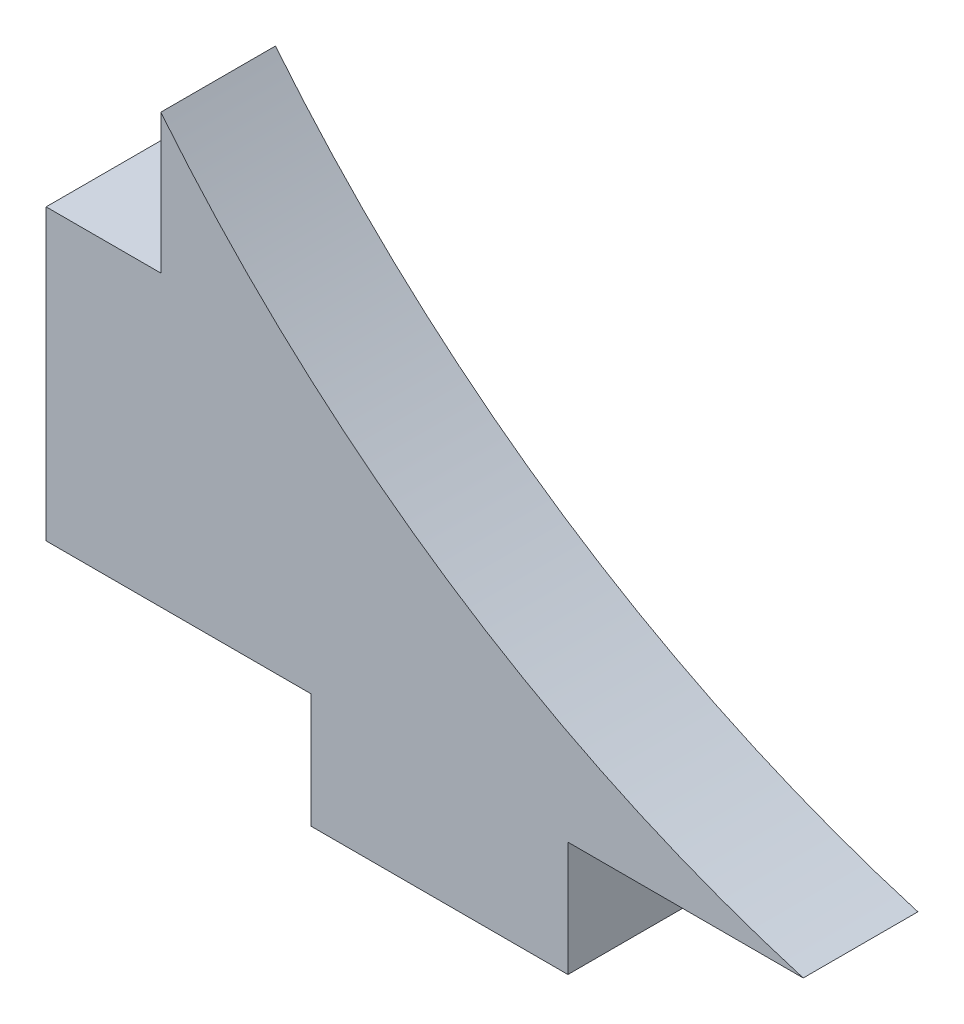
ISO-10303-21;
HEADER;
FILE_DESCRIPTION(('STEP AP214'),'2;1');
FILE_NAME('part.step','',(''),(''),'','','');
FILE_SCHEMA(('AUTOMOTIVE_DESIGN { 1 0 10303 214 1 1 1 1 }'));
ENDSEC;
DATA;
#1=APPLICATION_CONTEXT('core data for automotive mechanical design processes');
#2=APPLICATION_PROTOCOL_DEFINITION('international standard','automotive_design',2000,#1);
#3=PRODUCT_CONTEXT('',#1,'mechanical');
#4=PRODUCT('Part','Part','',(#3));
#5=PRODUCT_RELATED_PRODUCT_CATEGORY('part','',(#4));
#6=PRODUCT_DEFINITION_FORMATION('','',#4);
#7=PRODUCT_DEFINITION_CONTEXT('part definition',#1,'design');
#8=PRODUCT_DEFINITION('design','',#6,#7);
#9=PRODUCT_DEFINITION_SHAPE('','',#8);
#10=(LENGTH_UNIT() NAMED_UNIT(*) SI_UNIT(.MILLI.,.METRE.));
#11=(NAMED_UNIT(*) PLANE_ANGLE_UNIT() SI_UNIT($,.RADIAN.));
#12=(NAMED_UNIT(*) SI_UNIT($,.STERADIAN.) SOLID_ANGLE_UNIT());
#13=UNCERTAINTY_MEASURE_WITH_UNIT(LENGTH_MEASURE(1.E-05),#10,'distance_accuracy_value','');
#14=(GEOMETRIC_REPRESENTATION_CONTEXT(3) GLOBAL_UNCERTAINTY_ASSIGNED_CONTEXT((#13)) GLOBAL_UNIT_ASSIGNED_CONTEXT((#10,
#11,#12)) REPRESENTATION_CONTEXT('',''));
#15=CARTESIAN_POINT('',(0.,0.,0.));
#16=DIRECTION('',(0.,0.,1.));
#17=DIRECTION('',(1.,0.,0.));
#18=AXIS2_PLACEMENT_3D('',#15,#16,#17);
#19=CARTESIAN_POINT('',(34.0614146546456,63.4250505673138,5.35));
#20=DIRECTION('',(0.,0.,-1.));
#21=DIRECTION('',(-1.,0.,0.));
#22=AXIS2_PLACEMENT_3D('',#19,#20,#21);
#23=CYLINDRICAL_SURFACE('',#22,60.535);
#24=CARTESIAN_POINT('',(34.0614146546456,63.4250505673138,0.));
#25=DIRECTION('',(0.,0.,1.));
#26=DIRECTION('',(1.,0.,0.));
#27=AXIS2_PLACEMENT_3D('',#24,#25,#26);
#28=CIRCLE('',#27,60.535);
#29=CARTESIAN_POINT('',(-13.,25.35,0.));
#30=VERTEX_POINT('',#29);
#31=CARTESIAN_POINT('',(16.98,5.35,0.));
#32=VERTEX_POINT('',#31);
#33=EDGE_CURVE('E133',#30,#32,#28,.T.);
#34=ORIENTED_EDGE('',*,*,#33,.F.);
#35=DIRECTION('',(0.,0.,-1.));
#36=VECTOR('',#35,1.);
#37=CARTESIAN_POINT('',(-13.,25.35,5.35));
#38=LINE('',#37,#36);
#39=CARTESIAN_POINT('',(-13.,25.35,5.35));
#40=VERTEX_POINT('',#39);
#41=EDGE_CURVE('E11',#40,#30,#38,.T.);
#42=ORIENTED_EDGE('',*,*,#41,.F.);
#43=CARTESIAN_POINT('',(34.0614146546456,63.4250505673138,5.35));
#44=DIRECTION('',(0.,0.,1.));
#45=DIRECTION('',(1.,0.,0.));
#46=AXIS2_PLACEMENT_3D('',#43,#44,#45);
#47=CIRCLE('',#46,60.535);
#48=CARTESIAN_POINT('',(16.98,5.35,5.35));
#49=VERTEX_POINT('',#48);
#50=EDGE_CURVE('E155',#40,#49,#47,.T.);
#51=ORIENTED_EDGE('',*,*,#50,.T.);
#52=DIRECTION('',(0.,0.,-1.));
#53=VECTOR('',#52,1.);
#54=CARTESIAN_POINT('',(16.98,5.35,5.35));
#55=LINE('',#54,#53);
#56=EDGE_CURVE('E48',#49,#32,#55,.T.);
#57=ORIENTED_EDGE('',*,*,#56,.T.);
#58=EDGE_LOOP('',(#34,#42,#51,#57));
#59=FACE_BOUND('',#58,.T.);
#60=ADVANCED_FACE('F32',(#59),#23,.F.);
#61=CARTESIAN_POINT('',(-13.,0.,5.35));
#62=DIRECTION('',(1.,0.,0.));
#63=DIRECTION('',(0.,1.,0.));
#64=AXIS2_PLACEMENT_3D('',#61,#62,#63);
#65=PLANE('',#64);
#66=DIRECTION('',(0.,-1.,0.));
#67=VECTOR('',#66,1.);
#68=CARTESIAN_POINT('',(-13.,0.,0.));
#69=LINE('',#68,#67);
#70=CARTESIAN_POINT('',(-13.,18.85,0.));
#71=VERTEX_POINT('',#70);
#72=EDGE_CURVE('E135',#30,#71,#69,.T.);
#73=ORIENTED_EDGE('',*,*,#72,.T.);
#74=DIRECTION('',(0.,0.,-1.));
#75=VECTOR('',#74,1.);
#76=CARTESIAN_POINT('',(-13.,18.85,5.35));
#77=LINE('',#76,#75);
#78=CARTESIAN_POINT('',(-13.,18.85,5.35));
#79=VERTEX_POINT('',#78);
#80=EDGE_CURVE('E40',#79,#71,#77,.T.);
#81=ORIENTED_EDGE('',*,*,#80,.F.);
#82=DIRECTION('',(0.,-1.,0.));
#83=VECTOR('',#82,1.);
#84=CARTESIAN_POINT('',(-13.,0.,5.35));
#85=LINE('',#84,#83);
#86=EDGE_CURVE('E185',#40,#79,#85,.T.);
#87=ORIENTED_EDGE('',*,*,#86,.F.);
#88=ORIENTED_EDGE('',*,*,#41,.T.);
#89=EDGE_LOOP('',(#73,#81,#87,#88));
#90=FACE_BOUND('',#89,.T.);
#91=ADVANCED_FACE('F173',(#90),#65,.F.);
#92=CARTESIAN_POINT('',(0.,18.85,5.35));
#93=DIRECTION('',(0.,1.,0.));
#94=DIRECTION('',(-1.,0.,0.));
#95=AXIS2_PLACEMENT_3D('',#92,#93,#94);
#96=PLANE('',#95);
#97=DIRECTION('',(1.,0.,0.));
#98=VECTOR('',#97,1.);
#99=CARTESIAN_POINT('',(0.,18.85,0.));
#100=LINE('',#99,#98);
#101=CARTESIAN_POINT('',(-18.35,18.85,0.));
#102=VERTEX_POINT('',#101);
#103=EDGE_CURVE('E138',#102,#71,#100,.T.);
#104=ORIENTED_EDGE('',*,*,#103,.F.);
#105=DIRECTION('',(0.,0.,-1.));
#106=VECTOR('',#105,1.);
#107=CARTESIAN_POINT('',(-18.35,18.85,5.35));
#108=LINE('',#107,#106);
#109=CARTESIAN_POINT('',(-18.35,18.85,5.35));
#110=VERTEX_POINT('',#109);
#111=EDGE_CURVE('E163',#110,#102,#108,.T.);
#112=ORIENTED_EDGE('',*,*,#111,.F.);
#113=DIRECTION('',(1.,0.,0.));
#114=VECTOR('',#113,1.);
#115=CARTESIAN_POINT('',(0.,18.85,5.35));
#116=LINE('',#115,#114);
#117=EDGE_CURVE('E170',#110,#79,#116,.T.);
#118=ORIENTED_EDGE('',*,*,#117,.T.);
#119=ORIENTED_EDGE('',*,*,#80,.T.);
#120=EDGE_LOOP('',(#104,#112,#118,#119));
#121=FACE_BOUND('',#120,.T.);
#122=ADVANCED_FACE('F168',(#121),#96,.T.);
#123=CARTESIAN_POINT('',(-18.35,0.,5.35));
#124=DIRECTION('',(-1.,0.,0.));
#125=DIRECTION('',(0.,0.,1.));
#126=AXIS2_PLACEMENT_3D('',#123,#124,#125);
#127=PLANE('',#126);
#128=DIRECTION('',(0.,1.,0.));
#129=VECTOR('',#128,1.);
#130=CARTESIAN_POINT('',(-18.35,0.,0.));
#131=LINE('',#130,#129);
#132=CARTESIAN_POINT('',(-18.35,5.35,0.));
#133=VERTEX_POINT('',#132);
#134=EDGE_CURVE('E141',#133,#102,#131,.T.);
#135=ORIENTED_EDGE('',*,*,#134,.F.);
#136=DIRECTION('',(0.,0.,-1.));
#137=VECTOR('',#136,1.);
#138=CARTESIAN_POINT('',(-18.35,5.35,5.35));
#139=LINE('',#138,#137);
#140=CARTESIAN_POINT('',(-18.35,5.35,5.35));
#141=VERTEX_POINT('',#140);
#142=EDGE_CURVE('E161',#141,#133,#139,.T.);
#143=ORIENTED_EDGE('',*,*,#142,.F.);
#144=DIRECTION('',(0.,1.,0.));
#145=VECTOR('',#144,1.);
#146=CARTESIAN_POINT('',(-18.35,0.,5.35));
#147=LINE('',#146,#145);
#148=EDGE_CURVE('E183',#141,#110,#147,.T.);
#149=ORIENTED_EDGE('',*,*,#148,.T.);
#150=ORIENTED_EDGE('',*,*,#111,.T.);
#151=EDGE_LOOP('',(#135,#143,#149,#150));
#152=FACE_BOUND('',#151,.T.);
#153=ADVANCED_FACE('F180',(#152),#127,.T.);
#154=CARTESIAN_POINT('',(0.,5.35,5.35));
#155=DIRECTION('',(0.,-1.,0.));
#156=DIRECTION('',(1.,0.,0.));
#157=AXIS2_PLACEMENT_3D('',#154,#155,#156);
#158=PLANE('',#157);
#159=DIRECTION('',(-1.,0.,0.));
#160=VECTOR('',#159,1.);
#161=CARTESIAN_POINT('',(0.,5.35,0.));
#162=LINE('',#161,#160);
#163=CARTESIAN_POINT('',(-6.,5.35,0.));
#164=VERTEX_POINT('',#163);
#165=EDGE_CURVE('E144',#164,#133,#162,.T.);
#166=ORIENTED_EDGE('',*,*,#165,.F.);
#167=DIRECTION('',(0.,0.,-1.));
#168=VECTOR('',#167,1.);
#169=CARTESIAN_POINT('',(-6.,5.35,5.35));
#170=LINE('',#169,#168);
#171=CARTESIAN_POINT('',(-6.,5.35,5.35));
#172=VERTEX_POINT('',#171);
#173=EDGE_CURVE('E159',#172,#164,#170,.T.);
#174=ORIENTED_EDGE('',*,*,#173,.F.);
#175=DIRECTION('',(-1.,0.,0.));
#176=VECTOR('',#175,1.);
#177=CARTESIAN_POINT('',(0.,5.35,5.35));
#178=LINE('',#177,#176);
#179=EDGE_CURVE('E187',#172,#141,#178,.T.);
#180=ORIENTED_EDGE('',*,*,#179,.T.);
#181=ORIENTED_EDGE('',*,*,#142,.T.);
#182=EDGE_LOOP('',(#166,#174,#180,#181));
#183=FACE_BOUND('',#182,.T.);
#184=ADVANCED_FACE('F193',(#183),#158,.T.);
#185=CARTESIAN_POINT('',(-6.,0.,5.35));
#186=DIRECTION('',(1.,0.,0.));
#187=DIRECTION('',(0.,0.,-1.));
#188=AXIS2_PLACEMENT_3D('',#185,#186,#187);
#189=PLANE('',#188);
#190=DIRECTION('',(0.,-1.,0.));
#191=VECTOR('',#190,1.);
#192=CARTESIAN_POINT('',(-6.,0.,0.));
#193=LINE('',#192,#191);
#194=CARTESIAN_POINT('',(-6.,0.,0.));
#195=VERTEX_POINT('',#194);
#196=EDGE_CURVE('E147',#164,#195,#193,.T.);
#197=ORIENTED_EDGE('',*,*,#196,.T.);
#198=DIRECTION('',(0.,0.,-1.));
#199=VECTOR('',#198,1.);
#200=CARTESIAN_POINT('',(-6.,0.,5.35));
#201=LINE('',#200,#199);
#202=CARTESIAN_POINT('',(-6.,0.,5.35));
#203=VERTEX_POINT('',#202);
#204=EDGE_CURVE('E125',#203,#195,#201,.T.);
#205=ORIENTED_EDGE('',*,*,#204,.F.);
#206=DIRECTION('',(0.,-1.,0.));
#207=VECTOR('',#206,1.);
#208=CARTESIAN_POINT('',(-6.,0.,5.35));
#209=LINE('',#208,#207);
#210=EDGE_CURVE('E113',#172,#203,#209,.T.);
#211=ORIENTED_EDGE('',*,*,#210,.F.);
#212=ORIENTED_EDGE('',*,*,#173,.T.);
#213=EDGE_LOOP('',(#197,#205,#211,#212));
#214=FACE_BOUND('',#213,.T.);
#215=ADVANCED_FACE('F195',(#214),#189,.F.);
#216=CARTESIAN_POINT('',(0.,0.,5.35));
#217=DIRECTION('',(0.,1.,0.));
#218=DIRECTION('',(0.,0.,1.));
#219=AXIS2_PLACEMENT_3D('',#216,#217,#218);
#220=PLANE('',#219);
#221=DIRECTION('',(1.,0.,0.));
#222=VECTOR('',#221,1.);
#223=CARTESIAN_POINT('',(0.,0.,0.));
#224=LINE('',#223,#222);
#225=CARTESIAN_POINT('',(6.,0.,0.));
#226=VERTEX_POINT('',#225);
#227=EDGE_CURVE('E122',#195,#226,#224,.T.);
#228=ORIENTED_EDGE('',*,*,#227,.T.);
#229=DIRECTION('',(0.,0.,-1.));
#230=VECTOR('',#229,1.);
#231=CARTESIAN_POINT('',(6.,0.,5.35));
#232=LINE('',#231,#230);
#233=CARTESIAN_POINT('',(6.,0.,5.35));
#234=VERTEX_POINT('',#233);
#235=EDGE_CURVE('E119',#234,#226,#232,.T.);
#236=ORIENTED_EDGE('',*,*,#235,.F.);
#237=DIRECTION('',(1.,0.,0.));
#238=VECTOR('',#237,1.);
#239=CARTESIAN_POINT('',(0.,0.,5.35));
#240=LINE('',#239,#238);
#241=EDGE_CURVE('E104',#203,#234,#240,.T.);
#242=ORIENTED_EDGE('',*,*,#241,.F.);
#243=ORIENTED_EDGE('',*,*,#204,.T.);
#244=EDGE_LOOP('',(#228,#236,#242,#243));
#245=FACE_BOUND('',#244,.T.);
#246=ADVANCED_FACE('F120',(#245),#220,.F.);
#247=CARTESIAN_POINT('',(6.,0.,5.35));
#248=DIRECTION('',(1.,0.,0.));
#249=DIRECTION('',(0.,0.,-1.));
#250=AXIS2_PLACEMENT_3D('',#247,#248,#249);
#251=PLANE('',#250);
#252=DIRECTION('',(0.,-1.,0.));
#253=VECTOR('',#252,1.);
#254=CARTESIAN_POINT('',(6.,0.,0.));
#255=LINE('',#254,#253);
#256=CARTESIAN_POINT('',(6.,5.35,0.));
#257=VERTEX_POINT('',#256);
#258=EDGE_CURVE('E150',#257,#226,#255,.T.);
#259=ORIENTED_EDGE('',*,*,#258,.F.);
#260=DIRECTION('',(0.,0.,-1.));
#261=VECTOR('',#260,1.);
#262=CARTESIAN_POINT('',(6.,5.35,5.35));
#263=LINE('',#262,#261);
#264=CARTESIAN_POINT('',(6.,5.35,5.35));
#265=VERTEX_POINT('',#264);
#266=EDGE_CURVE('E76',#265,#257,#263,.T.);
#267=ORIENTED_EDGE('',*,*,#266,.F.);
#268=DIRECTION('',(0.,-1.,0.));
#269=VECTOR('',#268,1.);
#270=CARTESIAN_POINT('',(6.,0.,5.35));
#271=LINE('',#270,#269);
#272=EDGE_CURVE('E110',#265,#234,#271,.T.);
#273=ORIENTED_EDGE('',*,*,#272,.T.);
#274=ORIENTED_EDGE('',*,*,#235,.T.);
#275=EDGE_LOOP('',(#259,#267,#273,#274));
#276=FACE_BOUND('',#275,.T.);
#277=ADVANCED_FACE('F127',(#276),#251,.T.);
#278=CARTESIAN_POINT('',(0.,5.35,5.35));
#279=DIRECTION('',(0.,-1.,0.));
#280=DIRECTION('',(1.,0.,0.));
#281=AXIS2_PLACEMENT_3D('',#278,#279,#280);
#282=PLANE('',#281);
#283=DIRECTION('',(-1.,0.,0.));
#284=VECTOR('',#283,1.);
#285=CARTESIAN_POINT('',(0.,5.35,0.));
#286=LINE('',#285,#284);
#287=EDGE_CURVE('E152',#32,#257,#286,.T.);
#288=ORIENTED_EDGE('',*,*,#287,.F.);
#289=ORIENTED_EDGE('',*,*,#56,.F.);
#290=DIRECTION('',(-1.,0.,0.));
#291=VECTOR('',#290,1.);
#292=CARTESIAN_POINT('',(0.,5.35,5.35));
#293=LINE('',#292,#291);
#294=EDGE_CURVE('E128',#49,#265,#293,.T.);
#295=ORIENTED_EDGE('',*,*,#294,.T.);
#296=ORIENTED_EDGE('',*,*,#266,.T.);
#297=EDGE_LOOP('',(#288,#289,#295,#296));
#298=FACE_BOUND('',#297,.T.);
#299=ADVANCED_FACE('F196',(#298),#282,.T.);
#300=CARTESIAN_POINT('',(0.,0.,5.35));
#301=DIRECTION('',(0.,0.,1.));
#302=DIRECTION('',(1.,0.,0.));
#303=AXIS2_PLACEMENT_3D('',#300,#301,#302);
#304=PLANE('',#303);
#305=ORIENTED_EDGE('',*,*,#50,.F.);
#306=ORIENTED_EDGE('',*,*,#86,.T.);
#307=ORIENTED_EDGE('',*,*,#117,.F.);
#308=ORIENTED_EDGE('',*,*,#148,.F.);
#309=ORIENTED_EDGE('',*,*,#179,.F.);
#310=ORIENTED_EDGE('',*,*,#210,.T.);
#311=ORIENTED_EDGE('',*,*,#241,.T.);
#312=ORIENTED_EDGE('',*,*,#272,.F.);
#313=ORIENTED_EDGE('',*,*,#294,.F.);
#314=EDGE_LOOP('',(#305,#306,#307,#308,#309,#310,#311,#312,#313));
#315=FACE_BOUND('',#314,.T.);
#316=ADVANCED_FACE('F107',(#315),#304,.T.);
#317=CARTESIAN_POINT('',(0.,0.,0.));
#318=DIRECTION('',(0.,0.,1.));
#319=DIRECTION('',(1.,0.,0.));
#320=AXIS2_PLACEMENT_3D('',#317,#318,#319);
#321=PLANE('',#320);
#322=ORIENTED_EDGE('',*,*,#33,.T.);
#323=ORIENTED_EDGE('',*,*,#287,.T.);
#324=ORIENTED_EDGE('',*,*,#258,.T.);
#325=ORIENTED_EDGE('',*,*,#227,.F.);
#326=ORIENTED_EDGE('',*,*,#196,.F.);
#327=ORIENTED_EDGE('',*,*,#165,.T.);
#328=ORIENTED_EDGE('',*,*,#134,.T.);
#329=ORIENTED_EDGE('',*,*,#103,.T.);
#330=ORIENTED_EDGE('',*,*,#72,.F.);
#331=EDGE_LOOP('',(#322,#323,#324,#325,#326,#327,#328,#329,#330));
#332=FACE_BOUND('',#331,.T.);
#333=ADVANCED_FACE('F175',(#332),#321,.F.);
#334=CLOSED_SHELL('',(#60,#91,#122,#153,#184,#215,#246,#277,#299,#316,#333));
#335=MANIFOLD_SOLID_BREP('B2',#334);
#336=ADVANCED_BREP_SHAPE_REPRESENTATION('',(#18,#335),#14);
#337=SHAPE_DEFINITION_REPRESENTATION(#9,#336);
ENDSEC;
END-ISO-10303-21;
